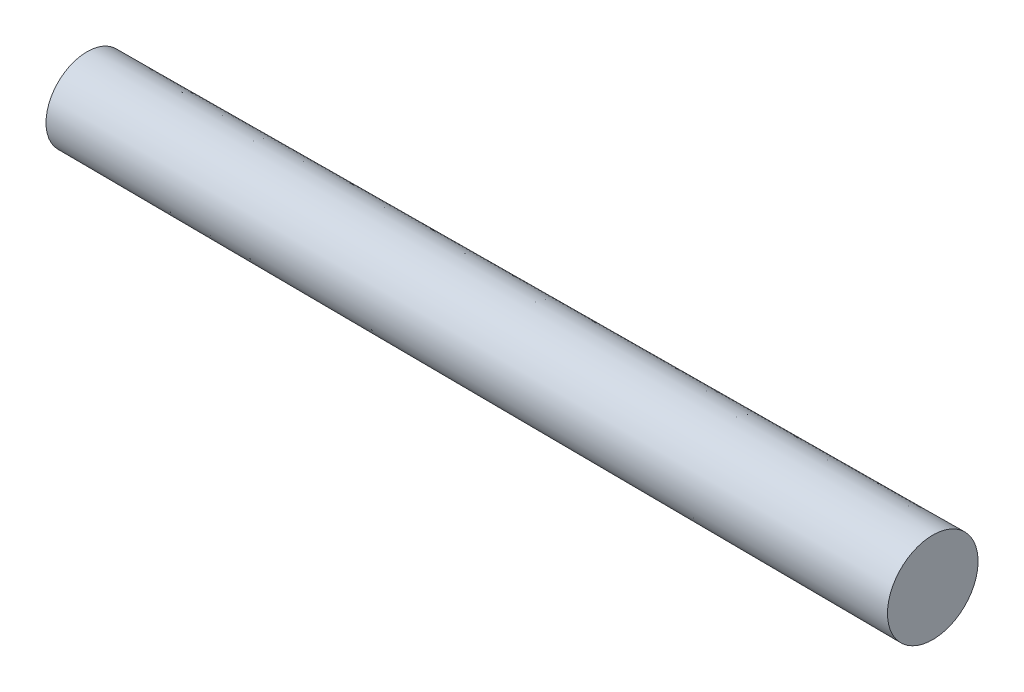
ISO-10303-21;
HEADER;
FILE_DESCRIPTION(('STEP AP214'),'2;1');
FILE_NAME('part.step','',(''),(''),'','','');
FILE_SCHEMA(('AUTOMOTIVE_DESIGN { 1 0 10303 214 1 1 1 1 }'));
ENDSEC;
DATA;
#1=APPLICATION_CONTEXT('core data for automotive mechanical design processes');
#2=APPLICATION_PROTOCOL_DEFINITION('international standard','automotive_design',2000,#1);
#3=PRODUCT_CONTEXT('',#1,'mechanical');
#4=PRODUCT('Part','Part','',(#3));
#5=PRODUCT_RELATED_PRODUCT_CATEGORY('part','',(#4));
#6=PRODUCT_DEFINITION_FORMATION('','',#4);
#7=PRODUCT_DEFINITION_CONTEXT('part definition',#1,'design');
#8=PRODUCT_DEFINITION('design','',#6,#7);
#9=PRODUCT_DEFINITION_SHAPE('','',#8);
#10=(LENGTH_UNIT() NAMED_UNIT(*) SI_UNIT(.MILLI.,.METRE.));
#11=(NAMED_UNIT(*) PLANE_ANGLE_UNIT() SI_UNIT($,.RADIAN.));
#12=(NAMED_UNIT(*) SI_UNIT($,.STERADIAN.) SOLID_ANGLE_UNIT());
#13=UNCERTAINTY_MEASURE_WITH_UNIT(LENGTH_MEASURE(1.E-05),#10,'distance_accuracy_value','');
#14=(GEOMETRIC_REPRESENTATION_CONTEXT(3) GLOBAL_UNCERTAINTY_ASSIGNED_CONTEXT((#13)) GLOBAL_UNIT_ASSIGNED_CONTEXT((#10,
#11,#12)) REPRESENTATION_CONTEXT('',''));
#15=CARTESIAN_POINT('',(0.,0.,0.));
#16=DIRECTION('',(0.,0.,1.));
#17=DIRECTION('',(1.,0.,0.));
#18=AXIS2_PLACEMENT_3D('',#15,#16,#17);
#19=CARTESIAN_POINT('',(0.,0.,0.));
#20=DIRECTION('',(1.,0.,0.));
#21=DIRECTION('',(0.,0.,-1.));
#22=AXIS2_PLACEMENT_3D('',#19,#20,#21);
#23=PLANE('',#22);
#24=CARTESIAN_POINT('',(0.,0.,0.));
#25=DIRECTION('',(-1.,0.,0.));
#26=DIRECTION('',(0.,0.,1.));
#27=AXIS2_PLACEMENT_3D('',#24,#25,#26);
#28=CIRCLE('',#27,2.72);
#29=CARTESIAN_POINT('',(0.,0.,2.72));
#30=VERTEX_POINT('',#29);
#31=EDGE_CURVE('E10',#30,#30,#28,.T.);
#32=ORIENTED_EDGE('',*,*,#31,.T.);
#33=EDGE_LOOP('',(#32));
#34=FACE_BOUND('',#33,.T.);
#35=ADVANCED_FACE('F37',(#34),#23,.F.);
#36=CARTESIAN_POINT('',(56.,0.,0.));
#37=DIRECTION('',(1.,0.,0.));
#38=DIRECTION('',(0.,0.,-1.));
#39=AXIS2_PLACEMENT_3D('',#36,#37,#38);
#40=CONICAL_SURFACE('',#39,3.,0.00499995833395832);
#41=ORIENTED_EDGE('',*,*,#31,.F.);
#42=EDGE_LOOP('',(#41));
#43=FACE_BOUND('',#42,.T.);
#44=CARTESIAN_POINT('',(56.,0.,0.));
#45=DIRECTION('',(-1.,0.,0.));
#46=DIRECTION('',(0.,0.,1.));
#47=AXIS2_PLACEMENT_3D('',#44,#45,#46);
#48=CIRCLE('',#47,3.);
#49=CARTESIAN_POINT('',(56.,0.,3.));
#50=VERTEX_POINT('',#49);
#51=EDGE_CURVE('E44',#50,#50,#48,.T.);
#52=ORIENTED_EDGE('',*,*,#51,.T.);
#53=EDGE_LOOP('',(#52));
#54=FACE_BOUND('',#53,.T.);
#55=ADVANCED_FACE('F51',(#43,#54),#40,.T.);
#56=CARTESIAN_POINT('',(56.,0.,0.));
#57=DIRECTION('',(-1.,0.,0.));
#58=DIRECTION('',(0.,0.,1.));
#59=AXIS2_PLACEMENT_3D('',#56,#57,#58);
#60=PLANE('',#59);
#61=ORIENTED_EDGE('',*,*,#51,.F.);
#62=EDGE_LOOP('',(#61));
#63=FACE_BOUND('',#62,.T.);
#64=ADVANCED_FACE('F53',(#63),#60,.F.);
#65=CLOSED_SHELL('',(#35,#55,#64));
#66=MANIFOLD_SOLID_BREP('B2',#65);
#67=ADVANCED_BREP_SHAPE_REPRESENTATION('',(#18,#66),#14);
#68=SHAPE_DEFINITION_REPRESENTATION(#9,#67);
ENDSEC;
END-ISO-10303-21;
